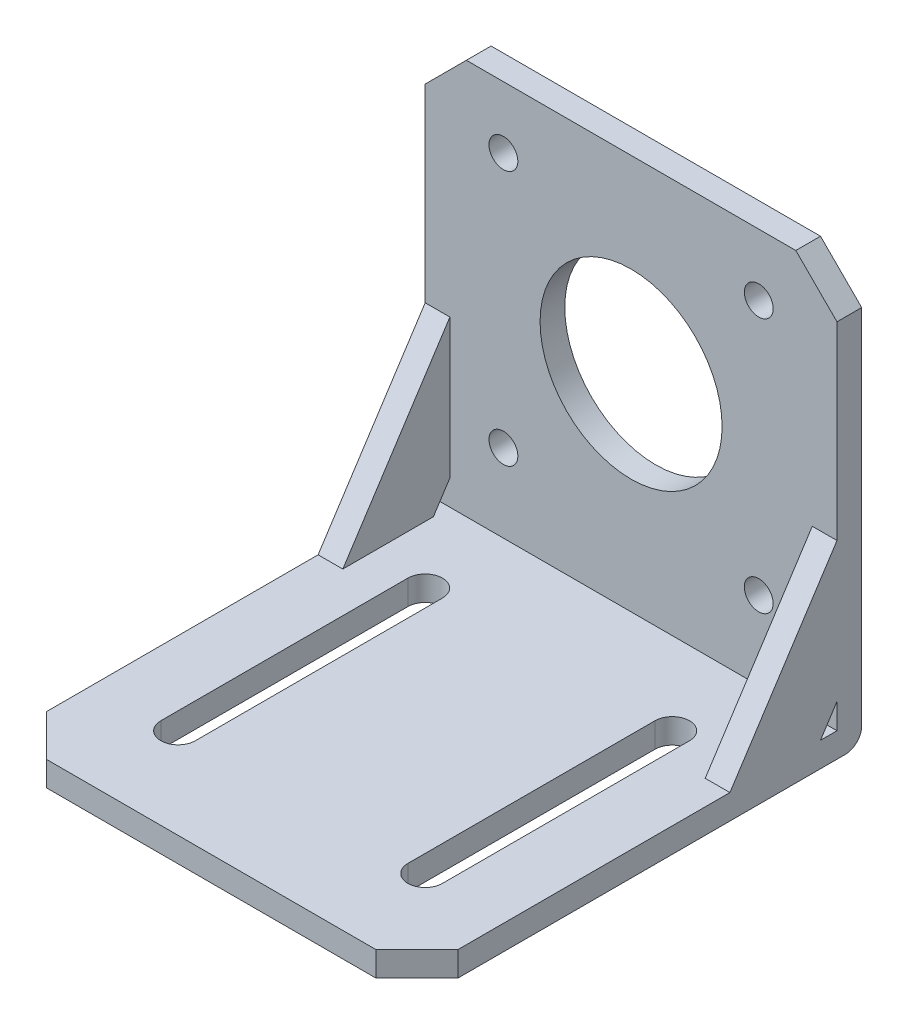
ISO-10303-21;
HEADER;
FILE_DESCRIPTION(('STEP AP214'),'2;1');
FILE_NAME('part.step','',(''),(''),'','','');
FILE_SCHEMA(('AUTOMOTIVE_DESIGN { 1 0 10303 214 1 1 1 1 }'));
ENDSEC;
DATA;
#1=APPLICATION_CONTEXT('core data for automotive mechanical design processes');
#2=APPLICATION_PROTOCOL_DEFINITION('international standard','automotive_design',2000,#1);
#3=PRODUCT_CONTEXT('',#1,'mechanical');
#4=PRODUCT('Part','Part','',(#3));
#5=PRODUCT_RELATED_PRODUCT_CATEGORY('part','',(#4));
#6=PRODUCT_DEFINITION_FORMATION('','',#4);
#7=PRODUCT_DEFINITION_CONTEXT('part definition',#1,'design');
#8=PRODUCT_DEFINITION('design','',#6,#7);
#9=PRODUCT_DEFINITION_SHAPE('','',#8);
#10=(LENGTH_UNIT() NAMED_UNIT(*) SI_UNIT(.MILLI.,.METRE.));
#11=(NAMED_UNIT(*) PLANE_ANGLE_UNIT() SI_UNIT($,.RADIAN.));
#12=(NAMED_UNIT(*) SI_UNIT($,.STERADIAN.) SOLID_ANGLE_UNIT());
#13=UNCERTAINTY_MEASURE_WITH_UNIT(LENGTH_MEASURE(1.E-05),#10,'distance_accuracy_value','');
#14=(GEOMETRIC_REPRESENTATION_CONTEXT(3) GLOBAL_UNCERTAINTY_ASSIGNED_CONTEXT((#13)) GLOBAL_UNIT_ASSIGNED_CONTEXT((#10,
#11,#12)) REPRESENTATION_CONTEXT('',''));
#15=CARTESIAN_POINT('',(0.,0.,0.));
#16=DIRECTION('',(0.,0.,1.));
#17=DIRECTION('',(1.,0.,0.));
#18=AXIS2_PLACEMENT_3D('',#15,#16,#17);
#19=CARTESIAN_POINT('',(0.,0.,3.));
#20=DIRECTION('',(0.,0.,-1.));
#21=DIRECTION('',(-1.,0.,0.));
#22=AXIS2_PLACEMENT_3D('',#19,#20,#21);
#23=PLANE('',#22);
#24=CARTESIAN_POINT('',(-15.5,27.2086800216875,3.));
#25=DIRECTION('',(0.,0.,1.));
#26=DIRECTION('',(1.,0.,0.));
#27=AXIS2_PLACEMENT_3D('',#24,#25,#26);
#28=CIRCLE('',#27,1.75);
#29=CARTESIAN_POINT('',(-13.75,27.2086800216875,3.));
#30=VERTEX_POINT('',#29);
#31=EDGE_CURVE('E379',#30,#30,#28,.T.);
#32=ORIENTED_EDGE('',*,*,#31,.F.);
#33=EDGE_LOOP('',(#32));
#34=FACE_BOUND('',#33,.T.);
#35=CARTESIAN_POINT('',(15.5,27.2086800216875,3.));
#36=DIRECTION('',(0.,0.,1.));
#37=DIRECTION('',(1.,0.,0.));
#38=AXIS2_PLACEMENT_3D('',#35,#36,#37);
#39=CIRCLE('',#38,1.75);
#40=CARTESIAN_POINT('',(17.25,27.2086800216875,3.));
#41=VERTEX_POINT('',#40);
#42=EDGE_CURVE('E373',#41,#41,#39,.T.);
#43=ORIENTED_EDGE('',*,*,#42,.F.);
#44=EDGE_LOOP('',(#43));
#45=FACE_BOUND('',#44,.T.);
#46=CARTESIAN_POINT('',(-15.5,-3.79131997831251,3.));
#47=DIRECTION('',(0.,0.,1.));
#48=DIRECTION('',(1.,0.,0.));
#49=AXIS2_PLACEMENT_3D('',#46,#47,#48);
#50=CIRCLE('',#49,1.75);
#51=CARTESIAN_POINT('',(-13.75,-3.79131997831251,3.));
#52=VERTEX_POINT('',#51);
#53=EDGE_CURVE('E367',#52,#52,#50,.T.);
#54=ORIENTED_EDGE('',*,*,#53,.F.);
#55=EDGE_LOOP('',(#54));
#56=FACE_BOUND('',#55,.T.);
#57=CARTESIAN_POINT('',(15.5,-3.79131997831251,3.));
#58=DIRECTION('',(0.,0.,1.));
#59=DIRECTION('',(1.,0.,0.));
#60=AXIS2_PLACEMENT_3D('',#57,#58,#59);
#61=CIRCLE('',#60,1.75);
#62=CARTESIAN_POINT('',(17.25,-3.79131997831251,3.));
#63=VERTEX_POINT('',#62);
#64=EDGE_CURVE('E361',#63,#63,#61,.T.);
#65=ORIENTED_EDGE('',*,*,#64,.F.);
#66=EDGE_LOOP('',(#65));
#67=FACE_BOUND('',#66,.T.);
#68=CARTESIAN_POINT('',(0.,11.7086800216875,3.));
#69=DIRECTION('',(0.,0.,1.));
#70=DIRECTION('',(1.,0.,0.));
#71=AXIS2_PLACEMENT_3D('',#68,#69,#70);
#72=CIRCLE('',#71,11.05);
#73=CARTESIAN_POINT('',(11.05,11.7086800216875,3.));
#74=VERTEX_POINT('',#73);
#75=EDGE_CURVE('E355',#74,#74,#72,.T.);
#76=ORIENTED_EDGE('',*,*,#75,.F.);
#77=EDGE_LOOP('',(#76));
#78=FACE_BOUND('',#77,.T.);
#79=DIRECTION('',(-1.,0.,0.));
#80=VECTOR('',#79,1.);
#81=CARTESIAN_POINT('',(-22.,6.70868002168749,3.));
#82=LINE('',#81,#80);
#83=CARTESIAN_POINT('',(-22.,6.70868002168749,3.));
#84=VERTEX_POINT('',#83);
#85=CARTESIAN_POINT('',(-25.,6.70868002168749,3.));
#86=VERTEX_POINT('',#85);
#87=EDGE_CURVE('E243',#84,#86,#82,.T.);
#88=ORIENTED_EDGE('',*,*,#87,.F.);
#89=DIRECTION('',(0.,1.,0.));
#90=VECTOR('',#89,1.);
#91=CARTESIAN_POINT('',(-22.,-10.2143969013894,3.));
#92=LINE('',#91,#90);
#93=CARTESIAN_POINT('',(-22.,-10.2143969013894,3.));
#94=VERTEX_POINT('',#93);
#95=EDGE_CURVE('E235',#94,#84,#92,.T.);
#96=ORIENTED_EDGE('',*,*,#95,.F.);
#97=DIRECTION('',(-1.,0.,0.));
#98=VECTOR('',#97,1.);
#99=CARTESIAN_POINT('',(-22.,-10.2143969013894,3.));
#100=LINE('',#99,#98);
#101=CARTESIAN_POINT('',(-25.,-10.2143969013894,3.));
#102=VERTEX_POINT('',#101);
#103=EDGE_CURVE('E234',#94,#102,#100,.T.);
#104=ORIENTED_EDGE('',*,*,#103,.T.);
#105=DIRECTION('',(0.,-1.,0.));
#106=VECTOR('',#105,1.);
#107=CARTESIAN_POINT('',(-25.,-16.2913199783125,3.));
#108=LINE('',#107,#106);
#109=CARTESIAN_POINT('',(-25.,-13.2913199783125,3.));
#110=VERTEX_POINT('',#109);
#111=EDGE_CURVE('E394',#102,#110,#108,.T.);
#112=ORIENTED_EDGE('',*,*,#111,.T.);
#113=DIRECTION('',(-1.,0.,0.));
#114=VECTOR('',#113,1.);
#115=CARTESIAN_POINT('',(-25.,-13.2913199783125,3.));
#116=LINE('',#115,#114);
#117=CARTESIAN_POINT('',(25.,-13.2913199783125,3.));
#118=VERTEX_POINT('',#117);
#119=EDGE_CURVE('E340',#118,#110,#116,.T.);
#120=ORIENTED_EDGE('',*,*,#119,.F.);
#121=DIRECTION('',(0.,1.,0.));
#122=VECTOR('',#121,1.);
#123=CARTESIAN_POINT('',(25.,29.7086800216875,3.));
#124=LINE('',#123,#122);
#125=CARTESIAN_POINT('',(25.,-10.2143969013894,3.));
#126=VERTEX_POINT('',#125);
#127=EDGE_CURVE('E385',#118,#126,#124,.T.);
#128=ORIENTED_EDGE('',*,*,#127,.T.);
#129=DIRECTION('',(1.,0.,0.));
#130=VECTOR('',#129,1.);
#131=CARTESIAN_POINT('',(22.,-10.2143969013894,3.));
#132=LINE('',#131,#130);
#133=CARTESIAN_POINT('',(22.,-10.2143969013894,3.));
#134=VERTEX_POINT('',#133);
#135=EDGE_CURVE('E265',#134,#126,#132,.T.);
#136=ORIENTED_EDGE('',*,*,#135,.F.);
#137=DIRECTION('',(0.,1.,0.));
#138=VECTOR('',#137,1.);
#139=CARTESIAN_POINT('',(22.,-10.2143969013894,3.));
#140=LINE('',#139,#138);
#141=CARTESIAN_POINT('',(22.,6.70868002168749,3.));
#142=VERTEX_POINT('',#141);
#143=EDGE_CURVE('E248',#134,#142,#140,.T.);
#144=ORIENTED_EDGE('',*,*,#143,.T.);
#145=DIRECTION('',(1.,0.,0.));
#146=VECTOR('',#145,1.);
#147=CARTESIAN_POINT('',(22.,6.70868002168749,3.));
#148=LINE('',#147,#146);
#149=CARTESIAN_POINT('',(25.,6.70868002168749,3.));
#150=VERTEX_POINT('',#149);
#151=EDGE_CURVE('E259',#142,#150,#148,.T.);
#152=ORIENTED_EDGE('',*,*,#151,.T.);
#153=CARTESIAN_POINT('',(25.,29.7086800216875,3.));
#154=VERTEX_POINT('',#153);
#155=EDGE_CURVE('E388',#150,#154,#124,.T.);
#156=ORIENTED_EDGE('',*,*,#155,.T.);
#157=DIRECTION('',(-0.707106781186547,0.707106781186548,0.));
#158=VECTOR('',#157,1.);
#159=CARTESIAN_POINT('',(20.,34.7086800216875,3.));
#160=LINE('',#159,#158);
#161=CARTESIAN_POINT('',(20.,34.7086800216875,3.));
#162=VERTEX_POINT('',#161);
#163=EDGE_CURVE('E387',#154,#162,#160,.T.);
#164=ORIENTED_EDGE('',*,*,#163,.T.);
#165=DIRECTION('',(-1.,0.,0.));
#166=VECTOR('',#165,1.);
#167=CARTESIAN_POINT('',(-20.,34.7086800216875,3.));
#168=LINE('',#167,#166);
#169=CARTESIAN_POINT('',(-20.,34.7086800216875,3.));
#170=VERTEX_POINT('',#169);
#171=EDGE_CURVE('E390',#162,#170,#168,.T.);
#172=ORIENTED_EDGE('',*,*,#171,.T.);
#173=DIRECTION('',(-0.707106781186548,-0.707106781186548,0.));
#174=VECTOR('',#173,1.);
#175=CARTESIAN_POINT('',(-25.,29.7086800216875,3.));
#176=LINE('',#175,#174);
#177=CARTESIAN_POINT('',(-25.,29.7086800216875,3.));
#178=VERTEX_POINT('',#177);
#179=EDGE_CURVE('E392',#170,#178,#176,.T.);
#180=ORIENTED_EDGE('',*,*,#179,.T.);
#181=EDGE_CURVE('E395',#178,#86,#108,.T.);
#182=ORIENTED_EDGE('',*,*,#181,.T.);
#183=EDGE_LOOP('',(#88,#96,#104,#112,#120,#128,#136,#144,#152,#156,#164,#172,#180,#182));
#184=FACE_BOUND('',#183,.T.);
#185=ADVANCED_FACE('F35',(#34,#45,#56,#67,#78,#184),#23,.F.);
#186=CARTESIAN_POINT('',(-25.,-13.2913199783125,54.));
#187=DIRECTION('',(0.,-1.,0.));
#188=DIRECTION('',(1.,0.,0.));
#189=AXIS2_PLACEMENT_3D('',#186,#187,#188);
#190=PLANE('',#189);
#191=DIRECTION('',(0.,0.,1.));
#192=VECTOR('',#191,1.);
#193=CARTESIAN_POINT('',(-17.1,-13.2913199783125,13.));
#194=LINE('',#193,#192);
#195=CARTESIAN_POINT('',(-17.1,-13.2913199783125,13.));
#196=VERTEX_POINT('',#195);
#197=CARTESIAN_POINT('',(-17.1,-13.2913199783125,43.));
#198=VERTEX_POINT('',#197);
#199=EDGE_CURVE('E310',#196,#198,#194,.T.);
#200=ORIENTED_EDGE('',*,*,#199,.F.);
#201=CARTESIAN_POINT('',(-15.,-13.2913199783125,13.));
#202=DIRECTION('',(0.,1.,0.));
#203=DIRECTION('',(0.,0.,1.));
#204=AXIS2_PLACEMENT_3D('',#201,#202,#203);
#205=CIRCLE('',#204,2.1);
#206=CARTESIAN_POINT('',(-12.9,-13.2913199783125,13.));
#207=VERTEX_POINT('',#206);
#208=EDGE_CURVE('E308',#207,#196,#205,.T.);
#209=ORIENTED_EDGE('',*,*,#208,.F.);
#210=DIRECTION('',(0.,0.,-1.));
#211=VECTOR('',#210,1.);
#212=CARTESIAN_POINT('',(-12.9,-13.2913199783125,43.));
#213=LINE('',#212,#211);
#214=CARTESIAN_POINT('',(-12.9,-13.2913199783125,43.));
#215=VERTEX_POINT('',#214);
#216=EDGE_CURVE('E316',#215,#207,#213,.T.);
#217=ORIENTED_EDGE('',*,*,#216,.F.);
#218=CARTESIAN_POINT('',(-15.,-13.2913199783125,43.));
#219=DIRECTION('',(0.,1.,0.));
#220=DIRECTION('',(0.,0.,1.));
#221=AXIS2_PLACEMENT_3D('',#218,#219,#220);
#222=CIRCLE('',#221,2.1);
#223=EDGE_CURVE('E313',#198,#215,#222,.T.);
#224=ORIENTED_EDGE('',*,*,#223,.F.);
#225=EDGE_LOOP('',(#200,#209,#217,#224));
#226=FACE_BOUND('',#225,.T.);
#227=DIRECTION('',(0.,0.,1.));
#228=VECTOR('',#227,1.);
#229=CARTESIAN_POINT('',(12.9,-13.2913199783125,13.));
#230=LINE('',#229,#228);
#231=CARTESIAN_POINT('',(12.9,-13.2913199783125,13.));
#232=VERTEX_POINT('',#231);
#233=CARTESIAN_POINT('',(12.9,-13.2913199783125,43.));
#234=VERTEX_POINT('',#233);
#235=EDGE_CURVE('E278',#232,#234,#230,.T.);
#236=ORIENTED_EDGE('',*,*,#235,.F.);
#237=CARTESIAN_POINT('',(15.,-13.2913199783125,13.));
#238=DIRECTION('',(0.,1.,0.));
#239=DIRECTION('',(0.,0.,1.));
#240=AXIS2_PLACEMENT_3D('',#237,#238,#239);
#241=CIRCLE('',#240,2.1);
#242=CARTESIAN_POINT('',(17.1,-13.2913199783125,13.));
#243=VERTEX_POINT('',#242);
#244=EDGE_CURVE('E268',#243,#232,#241,.T.);
#245=ORIENTED_EDGE('',*,*,#244,.F.);
#246=DIRECTION('',(0.,0.,-1.));
#247=VECTOR('',#246,1.);
#248=CARTESIAN_POINT('',(17.1,-13.2913199783125,13.));
#249=LINE('',#248,#247);
#250=CARTESIAN_POINT('',(17.1,-13.2913199783125,43.));
#251=VERTEX_POINT('',#250);
#252=EDGE_CURVE('E284',#251,#243,#249,.T.);
#253=ORIENTED_EDGE('',*,*,#252,.F.);
#254=CARTESIAN_POINT('',(15.,-13.2913199783125,43.));
#255=DIRECTION('',(0.,1.,0.));
#256=DIRECTION('',(0.,0.,1.));
#257=AXIS2_PLACEMENT_3D('',#254,#255,#256);
#258=CIRCLE('',#257,2.1);
#259=EDGE_CURVE('E281',#234,#251,#258,.T.);
#260=ORIENTED_EDGE('',*,*,#259,.F.);
#261=EDGE_LOOP('',(#236,#245,#253,#260));
#262=FACE_BOUND('',#261,.T.);
#263=DIRECTION('',(-1.,0.,0.));
#264=VECTOR('',#263,1.);
#265=CARTESIAN_POINT('',(-22.,-13.2913199783125,16.));
#266=LINE('',#265,#264);
#267=CARTESIAN_POINT('',(-22.,-13.2913199783125,16.));
#268=VERTEX_POINT('',#267);
#269=CARTESIAN_POINT('',(-25.,-13.2913199783125,16.));
#270=VERTEX_POINT('',#269);
#271=EDGE_CURVE('E241',#268,#270,#266,.T.);
#272=ORIENTED_EDGE('',*,*,#271,.T.);
#273=DIRECTION('',(0.,0.,-1.));
#274=VECTOR('',#273,1.);
#275=CARTESIAN_POINT('',(-25.,-13.2913199783125,54.));
#276=LINE('',#275,#274);
#277=CARTESIAN_POINT('',(-25.,-13.2913199783125,49.));
#278=VERTEX_POINT('',#277);
#279=EDGE_CURVE('E348',#278,#270,#276,.T.);
#280=ORIENTED_EDGE('',*,*,#279,.F.);
#281=DIRECTION('',(0.707106781186546,0.,0.70710678118655));
#282=VECTOR('',#281,1.);
#283=CARTESIAN_POINT('',(-20.,-13.2913199783125,54.));
#284=LINE('',#283,#282);
#285=CARTESIAN_POINT('',(-20.,-13.2913199783125,54.));
#286=VERTEX_POINT('',#285);
#287=EDGE_CURVE('E436',#278,#286,#284,.T.);
#288=ORIENTED_EDGE('',*,*,#287,.T.);
#289=DIRECTION('',(-1.,0.,0.));
#290=VECTOR('',#289,1.);
#291=CARTESIAN_POINT('',(-25.,-13.2913199783125,54.));
#292=LINE('',#291,#290);
#293=CARTESIAN_POINT('',(20.,-13.2913199783125,54.));
#294=VERTEX_POINT('',#293);
#295=EDGE_CURVE('E344',#294,#286,#292,.T.);
#296=ORIENTED_EDGE('',*,*,#295,.F.);
#297=DIRECTION('',(0.707106781186546,0.,-0.707106781186549));
#298=VECTOR('',#297,1.);
#299=CARTESIAN_POINT('',(20.,-13.2913199783125,54.));
#300=LINE('',#299,#298);
#301=CARTESIAN_POINT('',(25.,-13.2913199783125,49.));
#302=VERTEX_POINT('',#301);
#303=EDGE_CURVE('E434',#294,#302,#300,.T.);
#304=ORIENTED_EDGE('',*,*,#303,.T.);
#305=DIRECTION('',(0.,0.,-1.));
#306=VECTOR('',#305,1.);
#307=CARTESIAN_POINT('',(25.,-13.2913199783125,54.));
#308=LINE('',#307,#306);
#309=CARTESIAN_POINT('',(25.,-13.2913199783125,16.));
#310=VERTEX_POINT('',#309);
#311=EDGE_CURVE('E352',#302,#310,#308,.T.);
#312=ORIENTED_EDGE('',*,*,#311,.T.);
#313=DIRECTION('',(1.,0.,0.));
#314=VECTOR('',#313,1.);
#315=CARTESIAN_POINT('',(22.,-13.2913199783125,16.));
#316=LINE('',#315,#314);
#317=CARTESIAN_POINT('',(22.,-13.2913199783125,16.));
#318=VERTEX_POINT('',#317);
#319=EDGE_CURVE('E272',#318,#310,#316,.T.);
#320=ORIENTED_EDGE('',*,*,#319,.F.);
#321=DIRECTION('',(0.,0.,-1.));
#322=VECTOR('',#321,1.);
#323=CARTESIAN_POINT('',(22.,-13.2913199783125,16.));
#324=LINE('',#323,#322);
#325=CARTESIAN_POINT('',(22.,-13.2913199783125,5.));
#326=VERTEX_POINT('',#325);
#327=EDGE_CURVE('E254',#318,#326,#324,.T.);
#328=ORIENTED_EDGE('',*,*,#327,.T.);
#329=DIRECTION('',(1.,0.,0.));
#330=VECTOR('',#329,1.);
#331=CARTESIAN_POINT('',(22.,-13.2913199783125,5.));
#332=LINE('',#331,#330);
#333=CARTESIAN_POINT('',(25.,-13.2913199783125,5.));
#334=VERTEX_POINT('',#333);
#335=EDGE_CURVE('E269',#326,#334,#332,.T.);
#336=ORIENTED_EDGE('',*,*,#335,.T.);
#337=EDGE_CURVE('E351',#334,#118,#308,.T.);
#338=ORIENTED_EDGE('',*,*,#337,.T.);
#339=ORIENTED_EDGE('',*,*,#119,.T.);
#340=CARTESIAN_POINT('',(-25.,-13.2913199783125,5.));
#341=VERTEX_POINT('',#340);
#342=EDGE_CURVE('E240',#341,#110,#276,.T.);
#343=ORIENTED_EDGE('',*,*,#342,.F.);
#344=DIRECTION('',(-1.,0.,0.));
#345=VECTOR('',#344,1.);
#346=CARTESIAN_POINT('',(-22.,-13.2913199783125,5.));
#347=LINE('',#346,#345);
#348=CARTESIAN_POINT('',(-22.,-13.2913199783125,5.));
#349=VERTEX_POINT('',#348);
#350=EDGE_CURVE('E231',#349,#341,#347,.T.);
#351=ORIENTED_EDGE('',*,*,#350,.F.);
#352=DIRECTION('',(0.,0.,-1.));
#353=VECTOR('',#352,1.);
#354=CARTESIAN_POINT('',(-22.,-13.2913199783125,16.));
#355=LINE('',#354,#353);
#356=EDGE_CURVE('E214',#268,#349,#355,.T.);
#357=ORIENTED_EDGE('',*,*,#356,.F.);
#358=EDGE_LOOP('',(#272,#280,#288,#296,#304,#312,#320,#328,#336,#338,#339,#343,#351,#357));
#359=FACE_BOUND('',#358,.T.);
#360=ADVANCED_FACE('F237',(#226,#262,#359),#190,.F.);
#361=CARTESIAN_POINT('',(0.,0.,0.));
#362=DIRECTION('',(0.,0.,-1.));
#363=DIRECTION('',(-1.,0.,0.));
#364=AXIS2_PLACEMENT_3D('',#361,#362,#363);
#365=PLANE('',#364);
#366=CARTESIAN_POINT('',(15.5,-3.79131997831251,0.));
#367=DIRECTION('',(0.,0.,1.));
#368=DIRECTION('',(1.,0.,0.));
#369=AXIS2_PLACEMENT_3D('',#366,#367,#368);
#370=CIRCLE('',#369,1.75);
#371=CARTESIAN_POINT('',(17.25,-3.79131997831251,0.));
#372=VERTEX_POINT('',#371);
#373=EDGE_CURVE('E358',#372,#372,#370,.T.);
#374=ORIENTED_EDGE('',*,*,#373,.T.);
#375=EDGE_LOOP('',(#374));
#376=FACE_BOUND('',#375,.T.);
#377=CARTESIAN_POINT('',(15.5,27.2086800216875,0.));
#378=DIRECTION('',(0.,0.,1.));
#379=DIRECTION('',(1.,0.,0.));
#380=AXIS2_PLACEMENT_3D('',#377,#378,#379);
#381=CIRCLE('',#380,1.75);
#382=CARTESIAN_POINT('',(17.25,27.2086800216875,0.));
#383=VERTEX_POINT('',#382);
#384=EDGE_CURVE('E370',#383,#383,#381,.T.);
#385=ORIENTED_EDGE('',*,*,#384,.T.);
#386=EDGE_LOOP('',(#385));
#387=FACE_BOUND('',#386,.T.);
#388=DIRECTION('',(0.,1.,0.));
#389=VECTOR('',#388,1.);
#390=CARTESIAN_POINT('',(25.,29.7086800216875,0.));
#391=LINE('',#390,#389);
#392=CARTESIAN_POINT('',(25.,-14.2913199783125,0.));
#393=VERTEX_POINT('',#392);
#394=CARTESIAN_POINT('',(25.,29.7086800216875,0.));
#395=VERTEX_POINT('',#394);
#396=EDGE_CURVE('E382',#393,#395,#391,.T.);
#397=ORIENTED_EDGE('',*,*,#396,.F.);
#398=DIRECTION('',(-1.,0.,0.));
#399=VECTOR('',#398,1.);
#400=CARTESIAN_POINT('',(-25.,-14.2913199783125,0.));
#401=LINE('',#400,#399);
#402=CARTESIAN_POINT('',(-25.,-14.2913199783125,0.));
#403=VERTEX_POINT('',#402);
#404=EDGE_CURVE('E440',#393,#403,#401,.T.);
#405=ORIENTED_EDGE('',*,*,#404,.T.);
#406=DIRECTION('',(0.,-1.,0.));
#407=VECTOR('',#406,1.);
#408=CARTESIAN_POINT('',(-25.,-16.2913199783125,0.));
#409=LINE('',#408,#407);
#410=CARTESIAN_POINT('',(-25.,29.7086800216875,0.));
#411=VERTEX_POINT('',#410);
#412=EDGE_CURVE('E405',#411,#403,#409,.T.);
#413=ORIENTED_EDGE('',*,*,#412,.F.);
#414=DIRECTION('',(-0.707106781186548,-0.707106781186548,0.));
#415=VECTOR('',#414,1.);
#416=CARTESIAN_POINT('',(-25.,29.7086800216875,0.));
#417=LINE('',#416,#415);
#418=CARTESIAN_POINT('',(-20.,34.7086800216875,0.));
#419=VERTEX_POINT('',#418);
#420=EDGE_CURVE('E403',#419,#411,#417,.T.);
#421=ORIENTED_EDGE('',*,*,#420,.F.);
#422=DIRECTION('',(-1.,0.,0.));
#423=VECTOR('',#422,1.);
#424=CARTESIAN_POINT('',(-20.,34.7086800216875,0.));
#425=LINE('',#424,#423);
#426=CARTESIAN_POINT('',(20.,34.7086800216875,0.));
#427=VERTEX_POINT('',#426);
#428=EDGE_CURVE('E401',#427,#419,#425,.T.);
#429=ORIENTED_EDGE('',*,*,#428,.F.);
#430=DIRECTION('',(-0.707106781186547,0.707106781186548,0.));
#431=VECTOR('',#430,1.);
#432=CARTESIAN_POINT('',(20.,34.7086800216875,0.));
#433=LINE('',#432,#431);
#434=EDGE_CURVE('E399',#395,#427,#433,.T.);
#435=ORIENTED_EDGE('',*,*,#434,.F.);
#436=EDGE_LOOP('',(#397,#405,#413,#421,#429,#435));
#437=FACE_BOUND('',#436,.T.);
#438=CARTESIAN_POINT('',(-15.5,27.2086800216875,0.));
#439=DIRECTION('',(0.,0.,1.));
#440=DIRECTION('',(1.,0.,0.));
#441=AXIS2_PLACEMENT_3D('',#438,#439,#440);
#442=CIRCLE('',#441,1.75);
#443=CARTESIAN_POINT('',(-13.75,27.2086800216875,0.));
#444=VERTEX_POINT('',#443);
#445=EDGE_CURVE('E376',#444,#444,#442,.T.);
#446=ORIENTED_EDGE('',*,*,#445,.T.);
#447=EDGE_LOOP('',(#446));
#448=FACE_BOUND('',#447,.T.);
#449=CARTESIAN_POINT('',(-15.5,-3.79131997831251,0.));
#450=DIRECTION('',(0.,0.,1.));
#451=DIRECTION('',(1.,0.,0.));
#452=AXIS2_PLACEMENT_3D('',#449,#450,#451);
#453=CIRCLE('',#452,1.75);
#454=CARTESIAN_POINT('',(-13.75,-3.79131997831251,0.));
#455=VERTEX_POINT('',#454);
#456=EDGE_CURVE('E364',#455,#455,#453,.T.);
#457=ORIENTED_EDGE('',*,*,#456,.T.);
#458=EDGE_LOOP('',(#457));
#459=FACE_BOUND('',#458,.T.);
#460=CARTESIAN_POINT('',(0.,11.7086800216875,0.));
#461=DIRECTION('',(0.,0.,1.));
#462=DIRECTION('',(1.,0.,0.));
#463=AXIS2_PLACEMENT_3D('',#460,#461,#462);
#464=CIRCLE('',#463,11.05);
#465=CARTESIAN_POINT('',(11.05,11.7086800216875,0.));
#466=VERTEX_POINT('',#465);
#467=EDGE_CURVE('E354',#466,#466,#464,.T.);
#468=ORIENTED_EDGE('',*,*,#467,.T.);
#469=EDGE_LOOP('',(#468));
#470=FACE_BOUND('',#469,.T.);
#471=ADVANCED_FACE('F447',(#376,#387,#437,#448,#459,#470),#365,.T.);
#472=CARTESIAN_POINT('',(25.,-16.2913199783125,3.));
#473=DIRECTION('',(0.,1.,0.));
#474=DIRECTION('',(-1.,0.,0.));
#475=AXIS2_PLACEMENT_3D('',#472,#473,#474);
#476=PLANE('',#475);
#477=DIRECTION('',(0.,0.,-1.));
#478=VECTOR('',#477,1.);
#479=CARTESIAN_POINT('',(-25.,-16.2913199783125,3.));
#480=LINE('',#479,#478);
#481=CARTESIAN_POINT('',(-25.,-16.2913199783125,49.));
#482=VERTEX_POINT('',#481);
#483=CARTESIAN_POINT('',(-25.,-16.2913199783125,2.));
#484=VERTEX_POINT('',#483);
#485=EDGE_CURVE('E397',#482,#484,#480,.T.);
#486=ORIENTED_EDGE('',*,*,#485,.T.);
#487=DIRECTION('',(-1.,0.,0.));
#488=VECTOR('',#487,1.);
#489=CARTESIAN_POINT('',(25.,-16.2913199783125,2.));
#490=LINE('',#489,#488);
#491=CARTESIAN_POINT('',(25.,-16.2913199783125,2.));
#492=VERTEX_POINT('',#491);
#493=EDGE_CURVE('E43',#484,#492,#490,.F.);
#494=ORIENTED_EDGE('',*,*,#493,.T.);
#495=DIRECTION('',(0.,0.,-1.));
#496=VECTOR('',#495,1.);
#497=CARTESIAN_POINT('',(25.,-16.2913199783125,3.));
#498=LINE('',#497,#496);
#499=CARTESIAN_POINT('',(25.,-16.2913199783125,49.));
#500=VERTEX_POINT('',#499);
#501=EDGE_CURVE('E420',#500,#492,#498,.T.);
#502=ORIENTED_EDGE('',*,*,#501,.F.);
#503=DIRECTION('',(-0.707106781186546,0.,0.707106781186549));
#504=VECTOR('',#503,1.);
#505=CARTESIAN_POINT('',(20.,-16.2913199783125,54.));
#506=LINE('',#505,#504);
#507=CARTESIAN_POINT('',(20.,-16.2913199783125,54.));
#508=VERTEX_POINT('',#507);
#509=EDGE_CURVE('E428',#500,#508,#506,.T.);
#510=ORIENTED_EDGE('',*,*,#509,.T.);
#511=DIRECTION('',(1.,0.,0.));
#512=VECTOR('',#511,1.);
#513=CARTESIAN_POINT('',(-25.,-16.2913199783125,54.));
#514=LINE('',#513,#512);
#515=CARTESIAN_POINT('',(-20.,-16.2913199783125,54.));
#516=VERTEX_POINT('',#515);
#517=EDGE_CURVE('E341',#516,#508,#514,.T.);
#518=ORIENTED_EDGE('',*,*,#517,.F.);
#519=DIRECTION('',(-0.707106781186546,0.,-0.70710678118655));
#520=VECTOR('',#519,1.);
#521=CARTESIAN_POINT('',(-20.,-16.2913199783125,54.));
#522=LINE('',#521,#520);
#523=EDGE_CURVE('E430',#516,#482,#522,.T.);
#524=ORIENTED_EDGE('',*,*,#523,.T.);
#525=EDGE_LOOP('',(#486,#494,#502,#510,#518,#524));
#526=FACE_BOUND('',#525,.T.);
#527=DIRECTION('',(0.,0.,-1.));
#528=VECTOR('',#527,1.);
#529=CARTESIAN_POINT('',(-12.9,-16.2913199783125,2.99999999999999));
#530=LINE('',#529,#528);
#531=CARTESIAN_POINT('',(-12.9,-16.2913199783125,43.));
#532=VERTEX_POINT('',#531);
#533=CARTESIAN_POINT('',(-12.9,-16.2913199783125,13.));
#534=VERTEX_POINT('',#533);
#535=EDGE_CURVE('E334',#532,#534,#530,.T.);
#536=ORIENTED_EDGE('',*,*,#535,.T.);
#537=CARTESIAN_POINT('',(-15.,-16.2913199783125,13.));
#538=DIRECTION('',(0.,1.,0.));
#539=DIRECTION('',(-1.,0.,0.));
#540=AXIS2_PLACEMENT_3D('',#537,#538,#539);
#541=CIRCLE('',#540,2.1);
#542=CARTESIAN_POINT('',(-17.1,-16.2913199783125,13.));
#543=VERTEX_POINT('',#542);
#544=EDGE_CURVE('E337',#534,#543,#541,.T.);
#545=ORIENTED_EDGE('',*,*,#544,.T.);
#546=DIRECTION('',(0.,0.,1.));
#547=VECTOR('',#546,1.);
#548=CARTESIAN_POINT('',(-17.1,-16.2913199783125,2.99999999999999));
#549=LINE('',#548,#547);
#550=CARTESIAN_POINT('',(-17.1,-16.2913199783125,43.));
#551=VERTEX_POINT('',#550);
#552=EDGE_CURVE('E322',#543,#551,#549,.T.);
#553=ORIENTED_EDGE('',*,*,#552,.T.);
#554=CARTESIAN_POINT('',(-15.,-16.2913199783125,43.));
#555=DIRECTION('',(0.,1.,0.));
#556=DIRECTION('',(-1.,0.,0.));
#557=AXIS2_PLACEMENT_3D('',#554,#555,#556);
#558=CIRCLE('',#557,2.1);
#559=EDGE_CURVE('E331',#551,#532,#558,.T.);
#560=ORIENTED_EDGE('',*,*,#559,.T.);
#561=EDGE_LOOP('',(#536,#545,#553,#560));
#562=FACE_BOUND('',#561,.T.);
#563=DIRECTION('',(0.,0.,-1.));
#564=VECTOR('',#563,1.);
#565=CARTESIAN_POINT('',(17.1,-16.2913199783125,3.));
#566=LINE('',#565,#564);
#567=CARTESIAN_POINT('',(17.1,-16.2913199783125,43.));
#568=VERTEX_POINT('',#567);
#569=CARTESIAN_POINT('',(17.1,-16.2913199783125,13.));
#570=VERTEX_POINT('',#569);
#571=EDGE_CURVE('E302',#568,#570,#566,.T.);
#572=ORIENTED_EDGE('',*,*,#571,.T.);
#573=CARTESIAN_POINT('',(15.,-16.2913199783125,13.));
#574=DIRECTION('',(0.,1.,0.));
#575=DIRECTION('',(-1.,0.,0.));
#576=AXIS2_PLACEMENT_3D('',#573,#574,#575);
#577=CIRCLE('',#576,2.1);
#578=CARTESIAN_POINT('',(12.9,-16.2913199783125,13.));
#579=VERTEX_POINT('',#578);
#580=EDGE_CURVE('E305',#570,#579,#577,.T.);
#581=ORIENTED_EDGE('',*,*,#580,.T.);
#582=DIRECTION('',(0.,0.,1.));
#583=VECTOR('',#582,1.);
#584=CARTESIAN_POINT('',(12.9,-16.2913199783125,3.));
#585=LINE('',#584,#583);
#586=CARTESIAN_POINT('',(12.9,-16.2913199783125,43.));
#587=VERTEX_POINT('',#586);
#588=EDGE_CURVE('E290',#579,#587,#585,.T.);
#589=ORIENTED_EDGE('',*,*,#588,.T.);
#590=CARTESIAN_POINT('',(15.,-16.2913199783125,43.));
#591=DIRECTION('',(0.,1.,0.));
#592=DIRECTION('',(-1.,0.,0.));
#593=AXIS2_PLACEMENT_3D('',#590,#591,#592);
#594=CIRCLE('',#593,2.1);
#595=EDGE_CURVE('E299',#587,#568,#594,.T.);
#596=ORIENTED_EDGE('',*,*,#595,.T.);
#597=EDGE_LOOP('',(#572,#581,#589,#596));
#598=FACE_BOUND('',#597,.T.);
#599=ADVANCED_FACE('F494',(#526,#562,#598),#476,.F.);
#600=CARTESIAN_POINT('',(25.,29.7086800216875,3.));
#601=DIRECTION('',(-1.,0.,0.));
#602=DIRECTION('',(0.,-1.,0.));
#603=AXIS2_PLACEMENT_3D('',#600,#601,#602);
#604=PLANE('',#603);
#605=DIRECTION('',(0.,0.838443616300637,-0.544988350595414));
#606=VECTOR('',#605,1.);
#607=CARTESIAN_POINT('',(25.,-13.2913199783125,5.));
#608=LINE('',#607,#606);
#609=EDGE_CURVE('E251',#334,#126,#608,.T.);
#610=ORIENTED_EDGE('',*,*,#609,.T.);
#611=ORIENTED_EDGE('',*,*,#127,.F.);
#612=ORIENTED_EDGE('',*,*,#337,.F.);
#613=EDGE_LOOP('',(#610,#611,#612));
#614=FACE_BOUND('',#613,.T.);
#615=ORIENTED_EDGE('',*,*,#501,.T.);
#616=CARTESIAN_POINT('',(25.,-14.2913199783125,2.));
#617=DIRECTION('',(-1.,0.,0.));
#618=DIRECTION('',(0.,-1.,0.));
#619=AXIS2_PLACEMENT_3D('',#616,#617,#618);
#620=CIRCLE('',#619,2.);
#621=EDGE_CURVE('E11',#492,#393,#620,.F.);
#622=ORIENTED_EDGE('',*,*,#621,.T.);
#623=ORIENTED_EDGE('',*,*,#396,.T.);
#624=DIRECTION('',(0.,0.,-1.));
#625=VECTOR('',#624,1.);
#626=CARTESIAN_POINT('',(25.,29.7086800216875,3.));
#627=LINE('',#626,#625);
#628=EDGE_CURVE('E417',#154,#395,#627,.T.);
#629=ORIENTED_EDGE('',*,*,#628,.F.);
#630=ORIENTED_EDGE('',*,*,#155,.F.);
#631=DIRECTION('',(0.,-0.838443616300637,0.544988350595414));
#632=VECTOR('',#631,1.);
#633=CARTESIAN_POINT('',(25.,6.70868002168749,3.));
#634=LINE('',#633,#632);
#635=EDGE_CURVE('E260',#150,#310,#634,.T.);
#636=ORIENTED_EDGE('',*,*,#635,.T.);
#637=ORIENTED_EDGE('',*,*,#311,.F.);
#638=DIRECTION('',(0.,-1.,0.));
#639=VECTOR('',#638,1.);
#640=CARTESIAN_POINT('',(25.,-16.2913199783125,49.));
#641=LINE('',#640,#639);
#642=EDGE_CURVE('E438',#302,#500,#641,.T.);
#643=ORIENTED_EDGE('',*,*,#642,.T.);
#644=EDGE_LOOP('',(#615,#622,#623,#629,#630,#636,#637,#643));
#645=FACE_BOUND('',#644,.T.);
#646=ADVANCED_FACE('F472',(#614,#645),#604,.F.);
#647=CARTESIAN_POINT('',(20.,34.7086800216875,3.));
#648=DIRECTION('',(-0.707106781186548,-0.707106781186547,0.));
#649=DIRECTION('',(0.707106781186547,-0.707106781186548,0.));
#650=AXIS2_PLACEMENT_3D('',#647,#648,#649);
#651=PLANE('',#650);
#652=ORIENTED_EDGE('',*,*,#434,.T.);
#653=DIRECTION('',(0.,0.,-1.));
#654=VECTOR('',#653,1.);
#655=CARTESIAN_POINT('',(20.,34.7086800216875,3.));
#656=LINE('',#655,#654);
#657=EDGE_CURVE('E414',#162,#427,#656,.T.);
#658=ORIENTED_EDGE('',*,*,#657,.F.);
#659=ORIENTED_EDGE('',*,*,#163,.F.);
#660=ORIENTED_EDGE('',*,*,#628,.T.);
#661=EDGE_LOOP('',(#652,#658,#659,#660));
#662=FACE_BOUND('',#661,.T.);
#663=ADVANCED_FACE('F469',(#662),#651,.F.);
#664=CARTESIAN_POINT('',(-20.,34.7086800216875,3.));
#665=DIRECTION('',(0.,-1.,0.));
#666=DIRECTION('',(1.,0.,0.));
#667=AXIS2_PLACEMENT_3D('',#664,#665,#666);
#668=PLANE('',#667);
#669=ORIENTED_EDGE('',*,*,#428,.T.);
#670=DIRECTION('',(0.,0.,-1.));
#671=VECTOR('',#670,1.);
#672=CARTESIAN_POINT('',(-20.,34.7086800216875,3.));
#673=LINE('',#672,#671);
#674=EDGE_CURVE('E411',#170,#419,#673,.T.);
#675=ORIENTED_EDGE('',*,*,#674,.F.);
#676=ORIENTED_EDGE('',*,*,#171,.F.);
#677=ORIENTED_EDGE('',*,*,#657,.T.);
#678=EDGE_LOOP('',(#669,#675,#676,#677));
#679=FACE_BOUND('',#678,.T.);
#680=ADVANCED_FACE('F464',(#679),#668,.F.);
#681=CARTESIAN_POINT('',(-25.,29.7086800216875,3.));
#682=DIRECTION('',(0.707106781186547,-0.707106781186547,0.));
#683=DIRECTION('',(0.707106781186548,0.707106781186548,0.));
#684=AXIS2_PLACEMENT_3D('',#681,#682,#683);
#685=PLANE('',#684);
#686=ORIENTED_EDGE('',*,*,#420,.T.);
#687=DIRECTION('',(0.,0.,-1.));
#688=VECTOR('',#687,1.);
#689=CARTESIAN_POINT('',(-25.,29.7086800216875,3.));
#690=LINE('',#689,#688);
#691=EDGE_CURVE('E408',#178,#411,#690,.T.);
#692=ORIENTED_EDGE('',*,*,#691,.F.);
#693=ORIENTED_EDGE('',*,*,#179,.F.);
#694=ORIENTED_EDGE('',*,*,#674,.T.);
#695=EDGE_LOOP('',(#686,#692,#693,#694));
#696=FACE_BOUND('',#695,.T.);
#697=ADVANCED_FACE('F460',(#696),#685,.F.);
#698=CARTESIAN_POINT('',(-25.,-16.2913199783125,3.));
#699=DIRECTION('',(1.,0.,0.));
#700=DIRECTION('',(0.,1.,0.));
#701=AXIS2_PLACEMENT_3D('',#698,#699,#700);
#702=PLANE('',#701);
#703=ORIENTED_EDGE('',*,*,#412,.T.);
#704=CARTESIAN_POINT('',(-25.,-14.2913199783125,2.));
#705=DIRECTION('',(1.,0.,0.));
#706=DIRECTION('',(0.,1.,0.));
#707=AXIS2_PLACEMENT_3D('',#704,#705,#706);
#708=CIRCLE('',#707,2.);
#709=EDGE_CURVE('E57',#403,#484,#708,.F.);
#710=ORIENTED_EDGE('',*,*,#709,.T.);
#711=ORIENTED_EDGE('',*,*,#485,.F.);
#712=DIRECTION('',(0.,1.,0.));
#713=VECTOR('',#712,1.);
#714=CARTESIAN_POINT('',(-25.,-13.2913199783125,49.));
#715=LINE('',#714,#713);
#716=EDGE_CURVE('E432',#482,#278,#715,.T.);
#717=ORIENTED_EDGE('',*,*,#716,.T.);
#718=ORIENTED_EDGE('',*,*,#279,.T.);
#719=DIRECTION('',(0.,-0.838443616300637,0.544988350595414));
#720=VECTOR('',#719,1.);
#721=CARTESIAN_POINT('',(-25.,6.70868002168749,3.));
#722=LINE('',#721,#720);
#723=EDGE_CURVE('E538',#86,#270,#722,.T.);
#724=ORIENTED_EDGE('',*,*,#723,.F.);
#725=ORIENTED_EDGE('',*,*,#181,.F.);
#726=ORIENTED_EDGE('',*,*,#691,.T.);
#727=EDGE_LOOP('',(#703,#710,#711,#717,#718,#724,#725,#726));
#728=FACE_BOUND('',#727,.T.);
#729=ORIENTED_EDGE('',*,*,#111,.F.);
#730=DIRECTION('',(0.,0.838443616300637,-0.544988350595414));
#731=VECTOR('',#730,1.);
#732=CARTESIAN_POINT('',(-25.,-13.2913199783125,5.));
#733=LINE('',#732,#731);
#734=EDGE_CURVE('E539',#341,#102,#733,.T.);
#735=ORIENTED_EDGE('',*,*,#734,.F.);
#736=ORIENTED_EDGE('',*,*,#342,.T.);
#737=EDGE_LOOP('',(#729,#735,#736));
#738=FACE_BOUND('',#737,.T.);
#739=ADVANCED_FACE('F453',(#728,#738),#702,.F.);
#740=CARTESIAN_POINT('',(-15.5,27.2086800216875,3.));
#741=DIRECTION('',(0.,0.,-1.));
#742=DIRECTION('',(-1.,0.,0.));
#743=AXIS2_PLACEMENT_3D('',#740,#741,#742);
#744=CYLINDRICAL_SURFACE('',#743,1.75);
#745=ORIENTED_EDGE('',*,*,#31,.T.);
#746=EDGE_LOOP('',(#745));
#747=FACE_BOUND('',#746,.T.);
#748=ORIENTED_EDGE('',*,*,#445,.F.);
#749=EDGE_LOOP('',(#748));
#750=FACE_BOUND('',#749,.T.);
#751=ADVANCED_FACE('F490',(#747,#750),#744,.F.);
#752=CARTESIAN_POINT('',(15.5,27.2086800216875,3.));
#753=DIRECTION('',(0.,0.,-1.));
#754=DIRECTION('',(-1.,0.,0.));
#755=AXIS2_PLACEMENT_3D('',#752,#753,#754);
#756=CYLINDRICAL_SURFACE('',#755,1.75);
#757=ORIENTED_EDGE('',*,*,#42,.T.);
#758=EDGE_LOOP('',(#757));
#759=FACE_BOUND('',#758,.T.);
#760=ORIENTED_EDGE('',*,*,#384,.F.);
#761=EDGE_LOOP('',(#760));
#762=FACE_BOUND('',#761,.T.);
#763=ADVANCED_FACE('F612',(#759,#762),#756,.F.);
#764=CARTESIAN_POINT('',(-15.5,-3.79131997831251,3.));
#765=DIRECTION('',(0.,0.,-1.));
#766=DIRECTION('',(-1.,0.,0.));
#767=AXIS2_PLACEMENT_3D('',#764,#765,#766);
#768=CYLINDRICAL_SURFACE('',#767,1.75);
#769=ORIENTED_EDGE('',*,*,#53,.T.);
#770=EDGE_LOOP('',(#769));
#771=FACE_BOUND('',#770,.T.);
#772=ORIENTED_EDGE('',*,*,#456,.F.);
#773=EDGE_LOOP('',(#772));
#774=FACE_BOUND('',#773,.T.);
#775=ADVANCED_FACE('F609',(#771,#774),#768,.F.);
#776=CARTESIAN_POINT('',(15.5,-3.79131997831251,3.));
#777=DIRECTION('',(0.,0.,-1.));
#778=DIRECTION('',(-1.,0.,0.));
#779=AXIS2_PLACEMENT_3D('',#776,#777,#778);
#780=CYLINDRICAL_SURFACE('',#779,1.75);
#781=ORIENTED_EDGE('',*,*,#64,.T.);
#782=EDGE_LOOP('',(#781));
#783=FACE_BOUND('',#782,.T.);
#784=ORIENTED_EDGE('',*,*,#373,.F.);
#785=EDGE_LOOP('',(#784));
#786=FACE_BOUND('',#785,.T.);
#787=ADVANCED_FACE('F605',(#783,#786),#780,.F.);
#788=CARTESIAN_POINT('',(0.,11.7086800216875,3.));
#789=DIRECTION('',(0.,0.,-1.));
#790=DIRECTION('',(-1.,0.,0.));
#791=AXIS2_PLACEMENT_3D('',#788,#789,#790);
#792=CYLINDRICAL_SURFACE('',#791,11.05);
#793=ORIENTED_EDGE('',*,*,#75,.T.);
#794=EDGE_LOOP('',(#793));
#795=FACE_BOUND('',#794,.T.);
#796=ORIENTED_EDGE('',*,*,#467,.F.);
#797=EDGE_LOOP('',(#796));
#798=FACE_BOUND('',#797,.T.);
#799=ADVANCED_FACE('F601',(#795,#798),#792,.F.);
#800=CARTESIAN_POINT('',(0.,0.,54.));
#801=DIRECTION('',(0.,0.,1.));
#802=DIRECTION('',(1.,0.,0.));
#803=AXIS2_PLACEMENT_3D('',#800,#801,#802);
#804=PLANE('',#803);
#805=ORIENTED_EDGE('',*,*,#295,.T.);
#806=DIRECTION('',(0.,-1.,0.));
#807=VECTOR('',#806,1.);
#808=CARTESIAN_POINT('',(-20.,-16.2913199783125,54.));
#809=LINE('',#808,#807);
#810=EDGE_CURVE('E425',#286,#516,#809,.T.);
#811=ORIENTED_EDGE('',*,*,#810,.T.);
#812=ORIENTED_EDGE('',*,*,#517,.T.);
#813=DIRECTION('',(0.,1.,0.));
#814=VECTOR('',#813,1.);
#815=CARTESIAN_POINT('',(20.,-13.2913199783125,54.));
#816=LINE('',#815,#814);
#817=EDGE_CURVE('E422',#508,#294,#816,.T.);
#818=ORIENTED_EDGE('',*,*,#817,.T.);
#819=EDGE_LOOP('',(#805,#811,#812,#818));
#820=FACE_BOUND('',#819,.T.);
#821=ADVANCED_FACE('F529',(#820),#804,.T.);
#822=CARTESIAN_POINT('',(-15.,-64.2913199783125,13.));
#823=DIRECTION('',(0.,1.,0.));
#824=DIRECTION('',(0.,0.,1.));
#825=AXIS2_PLACEMENT_3D('',#822,#823,#824);
#826=CYLINDRICAL_SURFACE('',#825,2.1);
#827=DIRECTION('',(0.,1.,0.));
#828=VECTOR('',#827,1.);
#829=CARTESIAN_POINT('',(-12.9,-64.2913199783125,13.));
#830=LINE('',#829,#828);
#831=EDGE_CURVE('E320',#534,#207,#830,.T.);
#832=ORIENTED_EDGE('',*,*,#831,.T.);
#833=ORIENTED_EDGE('',*,*,#208,.T.);
#834=DIRECTION('',(0.,1.,0.));
#835=VECTOR('',#834,1.);
#836=CARTESIAN_POINT('',(-17.1,-64.2913199783125,13.));
#837=LINE('',#836,#835);
#838=EDGE_CURVE('E319',#543,#196,#837,.T.);
#839=ORIENTED_EDGE('',*,*,#838,.F.);
#840=ORIENTED_EDGE('',*,*,#544,.F.);
#841=EDGE_LOOP('',(#832,#833,#839,#840));
#842=FACE_BOUND('',#841,.T.);
#843=ADVANCED_FACE('F589',(#842),#826,.F.);
#844=CARTESIAN_POINT('',(-12.9,-64.2913199783125,43.));
#845=DIRECTION('',(1.,0.,0.));
#846=DIRECTION('',(0.,0.,-1.));
#847=AXIS2_PLACEMENT_3D('',#844,#845,#846);
#848=PLANE('',#847);
#849=DIRECTION('',(0.,1.,0.));
#850=VECTOR('',#849,1.);
#851=CARTESIAN_POINT('',(-12.9,-64.2913199783125,43.));
#852=LINE('',#851,#850);
#853=EDGE_CURVE('E323',#532,#215,#852,.T.);
#854=ORIENTED_EDGE('',*,*,#853,.T.);
#855=ORIENTED_EDGE('',*,*,#216,.T.);
#856=ORIENTED_EDGE('',*,*,#831,.F.);
#857=ORIENTED_EDGE('',*,*,#535,.F.);
#858=EDGE_LOOP('',(#854,#855,#856,#857));
#859=FACE_BOUND('',#858,.T.);
#860=ADVANCED_FACE('F585',(#859),#848,.F.);
#861=CARTESIAN_POINT('',(-15.,-64.2913199783125,43.));
#862=DIRECTION('',(0.,1.,0.));
#863=DIRECTION('',(0.,0.,1.));
#864=AXIS2_PLACEMENT_3D('',#861,#862,#863);
#865=CYLINDRICAL_SURFACE('',#864,2.1);
#866=DIRECTION('',(0.,1.,0.));
#867=VECTOR('',#866,1.);
#868=CARTESIAN_POINT('',(-17.1,-64.2913199783125,43.));
#869=LINE('',#868,#867);
#870=EDGE_CURVE('E325',#551,#198,#869,.T.);
#871=ORIENTED_EDGE('',*,*,#870,.T.);
#872=ORIENTED_EDGE('',*,*,#223,.T.);
#873=ORIENTED_EDGE('',*,*,#853,.F.);
#874=ORIENTED_EDGE('',*,*,#559,.F.);
#875=EDGE_LOOP('',(#871,#872,#873,#874));
#876=FACE_BOUND('',#875,.T.);
#877=ADVANCED_FACE('F588',(#876),#865,.F.);
#878=CARTESIAN_POINT('',(-17.1,-64.2913199783125,13.));
#879=DIRECTION('',(-1.,0.,0.));
#880=DIRECTION('',(0.,0.,1.));
#881=AXIS2_PLACEMENT_3D('',#878,#879,#880);
#882=PLANE('',#881);
#883=ORIENTED_EDGE('',*,*,#838,.T.);
#884=ORIENTED_EDGE('',*,*,#199,.T.);
#885=ORIENTED_EDGE('',*,*,#870,.F.);
#886=ORIENTED_EDGE('',*,*,#552,.F.);
#887=EDGE_LOOP('',(#883,#884,#885,#886));
#888=FACE_BOUND('',#887,.T.);
#889=ADVANCED_FACE('F583',(#888),#882,.F.);
#890=CARTESIAN_POINT('',(15.,-64.2913199783125,13.));
#891=DIRECTION('',(0.,1.,0.));
#892=DIRECTION('',(0.,0.,1.));
#893=AXIS2_PLACEMENT_3D('',#890,#891,#892);
#894=CYLINDRICAL_SURFACE('',#893,2.1);
#895=DIRECTION('',(0.,1.,0.));
#896=VECTOR('',#895,1.);
#897=CARTESIAN_POINT('',(17.1,-64.2913199783125,13.));
#898=LINE('',#897,#896);
#899=EDGE_CURVE('E288',#570,#243,#898,.T.);
#900=ORIENTED_EDGE('',*,*,#899,.T.);
#901=ORIENTED_EDGE('',*,*,#244,.T.);
#902=DIRECTION('',(0.,1.,0.));
#903=VECTOR('',#902,1.);
#904=CARTESIAN_POINT('',(12.9,-64.2913199783125,13.));
#905=LINE('',#904,#903);
#906=EDGE_CURVE('E287',#579,#232,#905,.T.);
#907=ORIENTED_EDGE('',*,*,#906,.F.);
#908=ORIENTED_EDGE('',*,*,#580,.F.);
#909=EDGE_LOOP('',(#900,#901,#907,#908));
#910=FACE_BOUND('',#909,.T.);
#911=ADVANCED_FACE('F573',(#910),#894,.F.);
#912=CARTESIAN_POINT('',(17.1,-64.2913199783125,13.));
#913=DIRECTION('',(1.,0.,0.));
#914=DIRECTION('',(0.,0.,-1.));
#915=AXIS2_PLACEMENT_3D('',#912,#913,#914);
#916=PLANE('',#915);
#917=DIRECTION('',(0.,1.,0.));
#918=VECTOR('',#917,1.);
#919=CARTESIAN_POINT('',(17.1,-64.2913199783125,43.));
#920=LINE('',#919,#918);
#921=EDGE_CURVE('E291',#568,#251,#920,.T.);
#922=ORIENTED_EDGE('',*,*,#921,.T.);
#923=ORIENTED_EDGE('',*,*,#252,.T.);
#924=ORIENTED_EDGE('',*,*,#899,.F.);
#925=ORIENTED_EDGE('',*,*,#571,.F.);
#926=EDGE_LOOP('',(#922,#923,#924,#925));
#927=FACE_BOUND('',#926,.T.);
#928=ADVANCED_FACE('F569',(#927),#916,.F.);
#929=CARTESIAN_POINT('',(15.,-64.2913199783125,43.));
#930=DIRECTION('',(0.,1.,0.));
#931=DIRECTION('',(0.,0.,1.));
#932=AXIS2_PLACEMENT_3D('',#929,#930,#931);
#933=CYLINDRICAL_SURFACE('',#932,2.1);
#934=DIRECTION('',(0.,1.,0.));
#935=VECTOR('',#934,1.);
#936=CARTESIAN_POINT('',(12.9,-64.2913199783125,43.));
#937=LINE('',#936,#935);
#938=EDGE_CURVE('E293',#587,#234,#937,.T.);
#939=ORIENTED_EDGE('',*,*,#938,.T.);
#940=ORIENTED_EDGE('',*,*,#259,.T.);
#941=ORIENTED_EDGE('',*,*,#921,.F.);
#942=ORIENTED_EDGE('',*,*,#595,.F.);
#943=EDGE_LOOP('',(#939,#940,#941,#942));
#944=FACE_BOUND('',#943,.T.);
#945=ADVANCED_FACE('F572',(#944),#933,.F.);
#946=CARTESIAN_POINT('',(12.9,-64.2913199783125,13.));
#947=DIRECTION('',(-1.,0.,0.));
#948=DIRECTION('',(0.,0.,1.));
#949=AXIS2_PLACEMENT_3D('',#946,#947,#948);
#950=PLANE('',#949);
#951=ORIENTED_EDGE('',*,*,#906,.T.);
#952=ORIENTED_EDGE('',*,*,#235,.T.);
#953=ORIENTED_EDGE('',*,*,#938,.F.);
#954=ORIENTED_EDGE('',*,*,#588,.F.);
#955=EDGE_LOOP('',(#951,#952,#953,#954));
#956=FACE_BOUND('',#955,.T.);
#957=ADVANCED_FACE('F512',(#956),#950,.F.);
#958=CARTESIAN_POINT('',(-20.,0.,54.));
#959=DIRECTION('',(-0.70710678118655,0.,0.707106781186546));
#960=DIRECTION('',(0.,1.,0.));
#961=AXIS2_PLACEMENT_3D('',#958,#959,#960);
#962=PLANE('',#961);
#963=ORIENTED_EDGE('',*,*,#287,.F.);
#964=ORIENTED_EDGE('',*,*,#716,.F.);
#965=ORIENTED_EDGE('',*,*,#523,.F.);
#966=ORIENTED_EDGE('',*,*,#810,.F.);
#967=EDGE_LOOP('',(#963,#964,#965,#966));
#968=FACE_BOUND('',#967,.T.);
#969=ADVANCED_FACE('F509',(#968),#962,.T.);
#970=CARTESIAN_POINT('',(20.,0.,54.));
#971=DIRECTION('',(0.707106781186549,0.,0.707106781186546));
#972=DIRECTION('',(0.,-1.,0.));
#973=AXIS2_PLACEMENT_3D('',#970,#971,#972);
#974=PLANE('',#973);
#975=ORIENTED_EDGE('',*,*,#509,.F.);
#976=ORIENTED_EDGE('',*,*,#642,.F.);
#977=ORIENTED_EDGE('',*,*,#303,.F.);
#978=ORIENTED_EDGE('',*,*,#817,.F.);
#979=EDGE_LOOP('',(#975,#976,#977,#978));
#980=FACE_BOUND('',#979,.T.);
#981=ADVANCED_FACE('F511',(#980),#974,.T.);
#982=CARTESIAN_POINT('',(22.,-13.2913199783125,5.));
#983=DIRECTION('',(0.,-0.544988350595414,-0.838443616300637));
#984=DIRECTION('',(0.,0.838443616300637,-0.544988350595414));
#985=AXIS2_PLACEMENT_3D('',#982,#983,#984);
#986=PLANE('',#985);
#987=ORIENTED_EDGE('',*,*,#609,.F.);
#988=ORIENTED_EDGE('',*,*,#335,.F.);
#989=DIRECTION('',(0.,0.838443616300637,-0.544988350595414));
#990=VECTOR('',#989,1.);
#991=CARTESIAN_POINT('',(22.,-13.2913199783125,5.));
#992=LINE('',#991,#990);
#993=EDGE_CURVE('E256',#326,#134,#992,.T.);
#994=ORIENTED_EDGE('',*,*,#993,.T.);
#995=ORIENTED_EDGE('',*,*,#135,.T.);
#996=EDGE_LOOP('',(#987,#988,#994,#995));
#997=FACE_BOUND('',#996,.T.);
#998=ADVANCED_FACE('F515',(#997),#986,.T.);
#999=CARTESIAN_POINT('',(22.,6.70868002168749,3.));
#1000=DIRECTION('',(0.,0.544988350595414,0.838443616300637));
#1001=DIRECTION('',(0.,-0.838443616300637,0.544988350595414));
#1002=AXIS2_PLACEMENT_3D('',#999,#1000,#1001);
#1003=PLANE('',#1002);
#1004=ORIENTED_EDGE('',*,*,#635,.F.);
#1005=ORIENTED_EDGE('',*,*,#151,.F.);
#1006=DIRECTION('',(0.,-0.838443616300637,0.544988350595414));
#1007=VECTOR('',#1006,1.);
#1008=CARTESIAN_POINT('',(22.,6.70868002168749,3.));
#1009=LINE('',#1008,#1007);
#1010=EDGE_CURVE('E250',#142,#318,#1009,.T.);
#1011=ORIENTED_EDGE('',*,*,#1010,.T.);
#1012=ORIENTED_EDGE('',*,*,#319,.T.);
#1013=EDGE_LOOP('',(#1004,#1005,#1011,#1012));
#1014=FACE_BOUND('',#1013,.T.);
#1015=ADVANCED_FACE('F520',(#1014),#1003,.T.);
#1016=CARTESIAN_POINT('',(22.,0.,0.));
#1017=DIRECTION('',(-1.,0.,0.));
#1018=DIRECTION('',(0.,0.,1.));
#1019=AXIS2_PLACEMENT_3D('',#1016,#1017,#1018);
#1020=PLANE('',#1019);
#1021=ORIENTED_EDGE('',*,*,#143,.F.);
#1022=ORIENTED_EDGE('',*,*,#993,.F.);
#1023=ORIENTED_EDGE('',*,*,#327,.F.);
#1024=ORIENTED_EDGE('',*,*,#1010,.F.);
#1025=EDGE_LOOP('',(#1021,#1022,#1023,#1024));
#1026=FACE_BOUND('',#1025,.T.);
#1027=ADVANCED_FACE('F556',(#1026),#1020,.T.);
#1028=CARTESIAN_POINT('',(-22.,6.70868002168749,3.));
#1029=DIRECTION('',(0.,-0.544988350595414,-0.838443616300637));
#1030=DIRECTION('',(0.,0.838443616300637,-0.544988350595414));
#1031=AXIS2_PLACEMENT_3D('',#1028,#1029,#1030);
#1032=PLANE('',#1031);
#1033=ORIENTED_EDGE('',*,*,#723,.T.);
#1034=ORIENTED_EDGE('',*,*,#271,.F.);
#1035=DIRECTION('',(0.,-0.838443616300637,0.544988350595414));
#1036=VECTOR('',#1035,1.);
#1037=CARTESIAN_POINT('',(-22.,6.70868002168749,3.));
#1038=LINE('',#1037,#1036);
#1039=EDGE_CURVE('E221',#84,#268,#1038,.T.);
#1040=ORIENTED_EDGE('',*,*,#1039,.F.);
#1041=ORIENTED_EDGE('',*,*,#87,.T.);
#1042=EDGE_LOOP('',(#1033,#1034,#1040,#1041));
#1043=FACE_BOUND('',#1042,.T.);
#1044=ADVANCED_FACE('F536',(#1043),#1032,.F.);
#1045=CARTESIAN_POINT('',(-22.,-13.2913199783125,5.));
#1046=DIRECTION('',(0.,0.544988350595414,0.838443616300637));
#1047=DIRECTION('',(0.,-0.838443616300637,0.544988350595414));
#1048=AXIS2_PLACEMENT_3D('',#1045,#1046,#1047);
#1049=PLANE('',#1048);
#1050=ORIENTED_EDGE('',*,*,#734,.T.);
#1051=ORIENTED_EDGE('',*,*,#103,.F.);
#1052=DIRECTION('',(0.,0.838443616300637,-0.544988350595414));
#1053=VECTOR('',#1052,1.);
#1054=CARTESIAN_POINT('',(-22.,-13.2913199783125,5.));
#1055=LINE('',#1054,#1053);
#1056=EDGE_CURVE('E218',#349,#94,#1055,.T.);
#1057=ORIENTED_EDGE('',*,*,#1056,.F.);
#1058=ORIENTED_EDGE('',*,*,#350,.T.);
#1059=EDGE_LOOP('',(#1050,#1051,#1057,#1058));
#1060=FACE_BOUND('',#1059,.T.);
#1061=ADVANCED_FACE('F230',(#1060),#1049,.F.);
#1062=CARTESIAN_POINT('',(-22.,0.,0.));
#1063=DIRECTION('',(1.,0.,0.));
#1064=DIRECTION('',(0.,0.,1.));
#1065=AXIS2_PLACEMENT_3D('',#1062,#1063,#1064);
#1066=PLANE('',#1065);
#1067=ORIENTED_EDGE('',*,*,#95,.T.);
#1068=ORIENTED_EDGE('',*,*,#1039,.T.);
#1069=ORIENTED_EDGE('',*,*,#356,.T.);
#1070=ORIENTED_EDGE('',*,*,#1056,.T.);
#1071=EDGE_LOOP('',(#1067,#1068,#1069,#1070));
#1072=FACE_BOUND('',#1071,.T.);
#1073=ADVANCED_FACE('F217',(#1072),#1066,.T.);
#1074=CARTESIAN_POINT('',(0.,-14.2913199783125,2.));
#1075=DIRECTION('',(1.,0.,0.));
#1076=DIRECTION('',(0.,1.,0.));
#1077=AXIS2_PLACEMENT_3D('',#1074,#1075,#1076);
#1078=CYLINDRICAL_SURFACE('',#1077,2.);
#1079=ORIENTED_EDGE('',*,*,#621,.F.);
#1080=ORIENTED_EDGE('',*,*,#493,.F.);
#1081=ORIENTED_EDGE('',*,*,#709,.F.);
#1082=ORIENTED_EDGE('',*,*,#404,.F.);
#1083=EDGE_LOOP('',(#1079,#1080,#1081,#1082));
#1084=FACE_BOUND('',#1083,.T.);
#1085=ADVANCED_FACE('F37',(#1084),#1078,.T.);
#1086=CLOSED_SHELL('',(#185,#360,#471,#599,#646,#663,#680,#697,#739,#751,#763,#775,#787,#799,
#821,#843,#860,#877,#889,#911,#928,#945,#957,#969,#981,#998,#1015,#1027,#1044,#1061,#1073,#1085));
#1087=MANIFOLD_SOLID_BREP('B2',#1086);
#1088=ADVANCED_BREP_SHAPE_REPRESENTATION('',(#18,#1087),#14);
#1089=SHAPE_DEFINITION_REPRESENTATION(#9,#1088);
ENDSEC;
END-ISO-10303-21;
